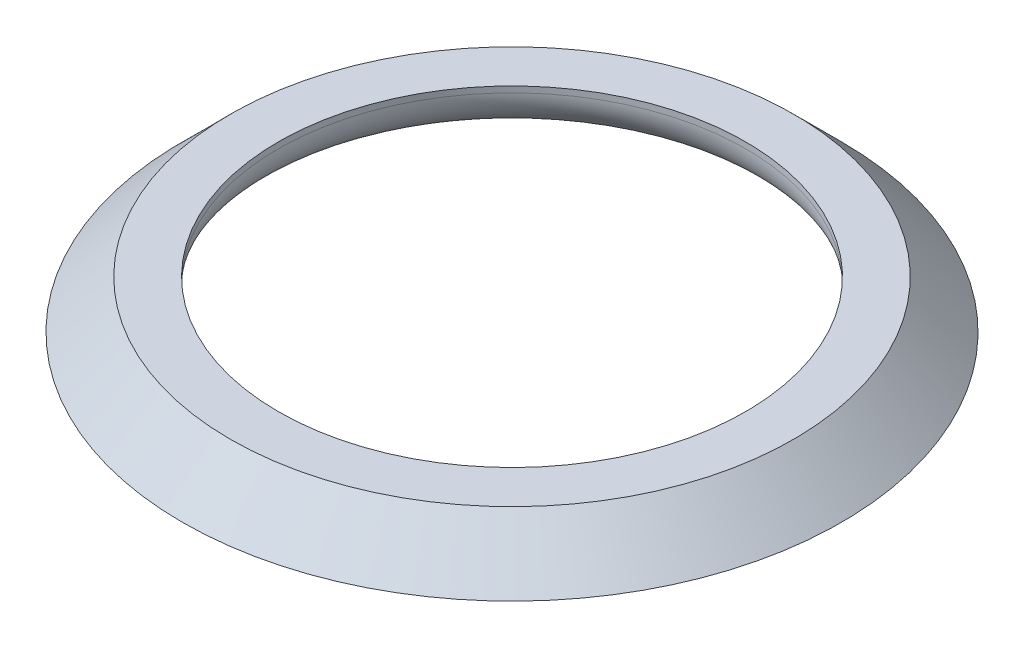
ISO-10303-21;
HEADER;
FILE_DESCRIPTION(('STEP AP214'),'2;1');
FILE_NAME('part.step','',(''),(''),'','','');
FILE_SCHEMA(('AUTOMOTIVE_DESIGN { 1 0 10303 214 1 1 1 1 }'));
ENDSEC;
DATA;
#1=APPLICATION_CONTEXT('core data for automotive mechanical design processes');
#2=APPLICATION_PROTOCOL_DEFINITION('international standard','automotive_design',2000,#1);
#3=PRODUCT_CONTEXT('',#1,'mechanical');
#4=PRODUCT('Part','Part','',(#3));
#5=PRODUCT_RELATED_PRODUCT_CATEGORY('part','',(#4));
#6=PRODUCT_DEFINITION_FORMATION('','',#4);
#7=PRODUCT_DEFINITION_CONTEXT('part definition',#1,'design');
#8=PRODUCT_DEFINITION('design','',#6,#7);
#9=PRODUCT_DEFINITION_SHAPE('','',#8);
#10=(LENGTH_UNIT() NAMED_UNIT(*) SI_UNIT(.MILLI.,.METRE.));
#11=(NAMED_UNIT(*) PLANE_ANGLE_UNIT() SI_UNIT($,.RADIAN.));
#12=(NAMED_UNIT(*) SI_UNIT($,.STERADIAN.) SOLID_ANGLE_UNIT());
#13=UNCERTAINTY_MEASURE_WITH_UNIT(LENGTH_MEASURE(1.E-05),#10,'distance_accuracy_value','');
#14=(GEOMETRIC_REPRESENTATION_CONTEXT(3) GLOBAL_UNCERTAINTY_ASSIGNED_CONTEXT((#13)) GLOBAL_UNIT_ASSIGNED_CONTEXT((#10,
#11,#12)) REPRESENTATION_CONTEXT('',''));
#15=CARTESIAN_POINT('',(0.,0.,0.));
#16=DIRECTION('',(0.,0.,1.));
#17=DIRECTION('',(1.,0.,0.));
#18=AXIS2_PLACEMENT_3D('',#15,#16,#17);
#19=CARTESIAN_POINT('',(0.,2.,0.));
#20=DIRECTION('',(0.,1.,0.));
#21=DIRECTION('',(0.,0.,1.));
#22=AXIS2_PLACEMENT_3D('',#19,#20,#21);
#23=PLANE('',#22);
#24=CARTESIAN_POINT('',(0.,2.,0.));
#25=DIRECTION('',(0.,1.,0.));
#26=DIRECTION('',(0.,0.,1.));
#27=AXIS2_PLACEMENT_3D('',#24,#25,#26);
#28=CIRCLE('',#27,11.75);
#29=CARTESIAN_POINT('',(0.,2.,11.75));
#30=VERTEX_POINT('',#29);
#31=EDGE_CURVE('E50',#30,#30,#28,.T.);
#32=ORIENTED_EDGE('',*,*,#31,.T.);
#33=EDGE_LOOP('',(#32));
#34=FACE_BOUND('',#33,.T.);
#35=CARTESIAN_POINT('',(0.,2.,0.));
#36=DIRECTION('',(0.,1.,0.));
#37=DIRECTION('',(0.,0.,1.));
#38=AXIS2_PLACEMENT_3D('',#35,#36,#37);
#39=CIRCLE('',#38,9.75);
#40=CARTESIAN_POINT('',(0.,2.,9.75));
#41=VERTEX_POINT('',#40);
#42=EDGE_CURVE('E59',#41,#41,#39,.T.);
#43=ORIENTED_EDGE('',*,*,#42,.F.);
#44=EDGE_LOOP('',(#43));
#45=FACE_BOUND('',#44,.T.);
#46=ADVANCED_FACE('F39',(#34,#45),#23,.T.);
#47=CARTESIAN_POINT('',(0.,0.,0.));
#48=DIRECTION('',(0.,1.,0.));
#49=DIRECTION('',(0.,0.,1.));
#50=AXIS2_PLACEMENT_3D('',#47,#48,#49);
#51=PLANE('',#50);
#52=CARTESIAN_POINT('',(0.,0.,0.));
#53=DIRECTION('',(0.,1.,0.));
#54=DIRECTION('',(0.,0.,1.));
#55=AXIS2_PLACEMENT_3D('',#52,#53,#54);
#56=CIRCLE('',#55,11.5);
#57=CARTESIAN_POINT('',(0.,0.,11.5));
#58=VERTEX_POINT('',#57);
#59=EDGE_CURVE('E46',#58,#58,#56,.T.);
#60=ORIENTED_EDGE('',*,*,#59,.T.);
#61=EDGE_LOOP('',(#60));
#62=FACE_BOUND('',#61,.T.);
#63=CARTESIAN_POINT('',(0.,0.,0.));
#64=DIRECTION('',(0.,1.,0.));
#65=DIRECTION('',(0.,0.,1.));
#66=AXIS2_PLACEMENT_3D('',#63,#64,#65);
#67=CIRCLE('',#66,13.75);
#68=CARTESIAN_POINT('',(0.,0.,13.75));
#69=VERTEX_POINT('',#68);
#70=EDGE_CURVE('E54',#69,#69,#67,.T.);
#71=ORIENTED_EDGE('',*,*,#70,.F.);
#72=EDGE_LOOP('',(#71));
#73=FACE_BOUND('',#72,.T.);
#74=ADVANCED_FACE('F66',(#62,#73),#51,.F.);
#75=CARTESIAN_POINT('',(0.,2.,0.));
#76=DIRECTION('',(0.,-1.,0.));
#77=DIRECTION('',(0.,0.,-1.));
#78=AXIS2_PLACEMENT_3D('',#75,#76,#77);
#79=CYLINDRICAL_SURFACE('',#78,9.75);
#80=CARTESIAN_POINT('',(0.,1.75,0.));
#81=DIRECTION('',(0.,1.,0.));
#82=DIRECTION('',(0.,0.,1.));
#83=AXIS2_PLACEMENT_3D('',#80,#81,#82);
#84=CIRCLE('',#83,9.75);
#85=CARTESIAN_POINT('',(0.,1.75,9.75));
#86=VERTEX_POINT('',#85);
#87=EDGE_CURVE('E10',#86,#86,#84,.F.);
#88=ORIENTED_EDGE('',*,*,#87,.T.);
#89=EDGE_LOOP('',(#88));
#90=FACE_BOUND('',#89,.T.);
#91=ORIENTED_EDGE('',*,*,#42,.T.);
#92=EDGE_LOOP('',(#91));
#93=FACE_BOUND('',#92,.T.);
#94=ADVANCED_FACE('F63',(#90,#93),#79,.F.);
#95=CARTESIAN_POINT('',(0.,2.,0.));
#96=DIRECTION('',(0.,-1.,0.));
#97=DIRECTION('',(0.,0.,-1.));
#98=AXIS2_PLACEMENT_3D('',#95,#96,#97);
#99=CONICAL_SURFACE('',#98,11.75,0.785398163397447);
#100=ORIENTED_EDGE('',*,*,#70,.T.);
#101=EDGE_LOOP('',(#100));
#102=FACE_BOUND('',#101,.T.);
#103=ORIENTED_EDGE('',*,*,#31,.F.);
#104=EDGE_LOOP('',(#103));
#105=FACE_BOUND('',#104,.T.);
#106=ADVANCED_FACE('F76',(#102,#105),#99,.T.);
#107=CARTESIAN_POINT('',(0.,1.75,0.));
#108=DIRECTION('',(0.,1.,0.));
#109=DIRECTION('',(0.,0.,1.));
#110=AXIS2_PLACEMENT_3D('',#107,#108,#109);
#111=TOROIDAL_SURFACE('',#110,11.5,1.75);
#112=ORIENTED_EDGE('',*,*,#87,.F.);
#113=EDGE_LOOP('',(#112));
#114=FACE_BOUND('',#113,.T.);
#115=ORIENTED_EDGE('',*,*,#59,.F.);
#116=EDGE_LOOP('',(#115));
#117=FACE_BOUND('',#116,.T.);
#118=ADVANCED_FACE('F41',(#114,#117),#111,.T.);
#119=CLOSED_SHELL('',(#46,#74,#94,#106,#118));
#120=MANIFOLD_SOLID_BREP('B2',#119);
#121=ADVANCED_BREP_SHAPE_REPRESENTATION('',(#18,#120),#14);
#122=SHAPE_DEFINITION_REPRESENTATION(#9,#121);
ENDSEC;
END-ISO-10303-21;
